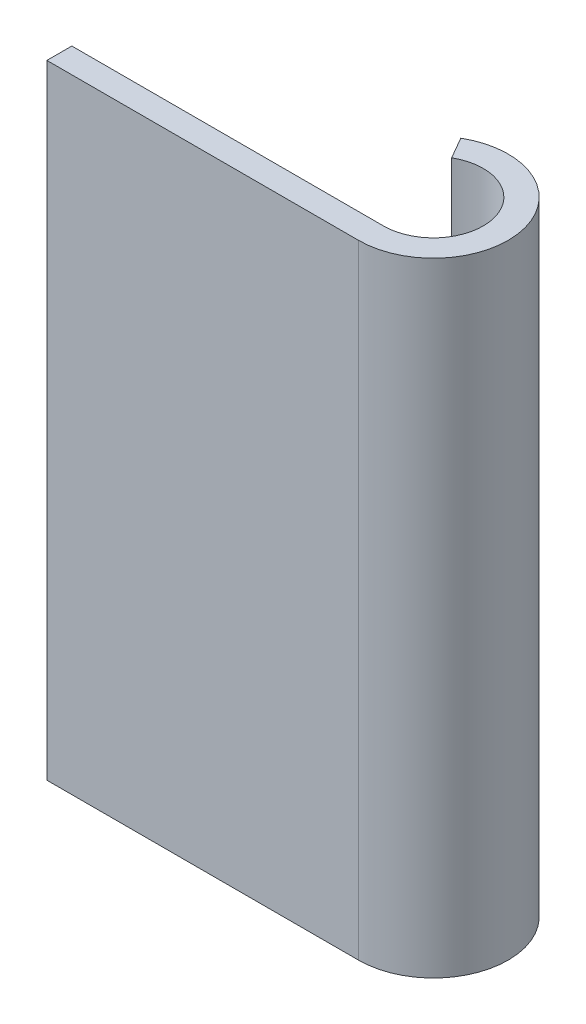
ISO-10303-21;
HEADER;
FILE_DESCRIPTION(('STEP AP214'),'2;1');
FILE_NAME('part.step','',(''),(''),'','','');
FILE_SCHEMA(('AUTOMOTIVE_DESIGN { 1 0 10303 214 1 1 1 1 }'));
ENDSEC;
DATA;
#1=APPLICATION_CONTEXT('core data for automotive mechanical design processes');
#2=APPLICATION_PROTOCOL_DEFINITION('international standard','automotive_design',2000,#1);
#3=PRODUCT_CONTEXT('',#1,'mechanical');
#4=PRODUCT('Part','Part','',(#3));
#5=PRODUCT_RELATED_PRODUCT_CATEGORY('part','',(#4));
#6=PRODUCT_DEFINITION_FORMATION('','',#4);
#7=PRODUCT_DEFINITION_CONTEXT('part definition',#1,'design');
#8=PRODUCT_DEFINITION('design','',#6,#7);
#9=PRODUCT_DEFINITION_SHAPE('','',#8);
#10=(LENGTH_UNIT() NAMED_UNIT(*) SI_UNIT(.MILLI.,.METRE.));
#11=(NAMED_UNIT(*) PLANE_ANGLE_UNIT() SI_UNIT($,.RADIAN.));
#12=(NAMED_UNIT(*) SI_UNIT($,.STERADIAN.) SOLID_ANGLE_UNIT());
#13=UNCERTAINTY_MEASURE_WITH_UNIT(LENGTH_MEASURE(1.E-05),#10,'distance_accuracy_value','');
#14=(GEOMETRIC_REPRESENTATION_CONTEXT(3) GLOBAL_UNCERTAINTY_ASSIGNED_CONTEXT((#13)) GLOBAL_UNIT_ASSIGNED_CONTEXT((#10,
#11,#12)) REPRESENTATION_CONTEXT('',''));
#15=CARTESIAN_POINT('',(0.,0.,0.));
#16=DIRECTION('',(0.,0.,1.));
#17=DIRECTION('',(1.,0.,0.));
#18=AXIS2_PLACEMENT_3D('',#15,#16,#17);
#19=CARTESIAN_POINT('',(0.,40.,0.));
#20=DIRECTION('',(0.,-1.,0.));
#21=DIRECTION('',(0.,0.,-1.));
#22=AXIS2_PLACEMENT_3D('',#19,#20,#21);
#23=CYLINDRICAL_SURFACE('',#22,3.2);
#24=CARTESIAN_POINT('',(0.,0.,0.));
#25=DIRECTION('',(0.,-1.,0.));
#26=DIRECTION('',(0.,0.,-1.));
#27=AXIS2_PLACEMENT_3D('',#24,#25,#26);
#28=CIRCLE('',#27,3.2);
#29=CARTESIAN_POINT('',(-1.60000000000001,0.,-2.7712812921102));
#30=VERTEX_POINT('',#29);
#31=CARTESIAN_POINT('',(0.,0.,3.2));
#32=VERTEX_POINT('',#31);
#33=EDGE_CURVE('E128',#30,#32,#28,.T.);
#34=ORIENTED_EDGE('',*,*,#33,.T.);
#35=DIRECTION('',(0.,-1.,0.));
#36=VECTOR('',#35,1.);
#37=CARTESIAN_POINT('',(0.,40.,3.2));
#38=LINE('',#37,#36);
#39=CARTESIAN_POINT('',(0.,40.,3.2));
#40=VERTEX_POINT('',#39);
#41=EDGE_CURVE('E11',#40,#32,#38,.T.);
#42=ORIENTED_EDGE('',*,*,#41,.F.);
#43=CARTESIAN_POINT('',(0.,40.,0.));
#44=DIRECTION('',(0.,-1.,0.));
#45=DIRECTION('',(0.,0.,-1.));
#46=AXIS2_PLACEMENT_3D('',#43,#44,#45);
#47=CIRCLE('',#46,3.2);
#48=CARTESIAN_POINT('',(-1.60000000000001,40.,-2.7712812921102));
#49=VERTEX_POINT('',#48);
#50=EDGE_CURVE('E144',#49,#40,#47,.T.);
#51=ORIENTED_EDGE('',*,*,#50,.F.);
#52=DIRECTION('',(0.,-1.,0.));
#53=VECTOR('',#52,1.);
#54=CARTESIAN_POINT('',(-1.60000000000001,40.,-2.7712812921102));
#55=LINE('',#54,#53);
#56=EDGE_CURVE('E124',#49,#30,#55,.T.);
#57=ORIENTED_EDGE('',*,*,#56,.T.);
#58=EDGE_LOOP('',(#34,#42,#51,#57));
#59=FACE_BOUND('',#58,.T.);
#60=ADVANCED_FACE('F39',(#59),#23,.F.);
#61=CARTESIAN_POINT('',(0.,40.,3.2));
#62=DIRECTION('',(0.,0.,1.));
#63=DIRECTION('',(1.,0.,0.));
#64=AXIS2_PLACEMENT_3D('',#61,#62,#63);
#65=PLANE('',#64);
#66=DIRECTION('',(-1.,0.,0.));
#67=VECTOR('',#66,1.);
#68=CARTESIAN_POINT('',(0.,0.,3.2));
#69=LINE('',#68,#67);
#70=CARTESIAN_POINT('',(-20.,0.,3.2));
#71=VERTEX_POINT('',#70);
#72=EDGE_CURVE('E132',#32,#71,#69,.T.);
#73=ORIENTED_EDGE('',*,*,#72,.T.);
#74=DIRECTION('',(0.,-1.,0.));
#75=VECTOR('',#74,1.);
#76=CARTESIAN_POINT('',(-20.,40.,3.2));
#77=LINE('',#76,#75);
#78=CARTESIAN_POINT('',(-20.,40.,3.2));
#79=VERTEX_POINT('',#78);
#80=EDGE_CURVE('E48',#79,#71,#77,.T.);
#81=ORIENTED_EDGE('',*,*,#80,.F.);
#82=DIRECTION('',(-1.,0.,0.));
#83=VECTOR('',#82,1.);
#84=CARTESIAN_POINT('',(0.,40.,3.2));
#85=LINE('',#84,#83);
#86=EDGE_CURVE('E93',#40,#79,#85,.T.);
#87=ORIENTED_EDGE('',*,*,#86,.F.);
#88=ORIENTED_EDGE('',*,*,#41,.T.);
#89=EDGE_LOOP('',(#73,#81,#87,#88));
#90=FACE_BOUND('',#89,.T.);
#91=ADVANCED_FACE('F172',(#90),#65,.F.);
#92=CARTESIAN_POINT('',(-20.,40.,3.2));
#93=DIRECTION('',(1.,0.,0.));
#94=DIRECTION('',(0.,0.,-1.));
#95=AXIS2_PLACEMENT_3D('',#92,#93,#94);
#96=PLANE('',#95);
#97=DIRECTION('',(0.,0.,1.));
#98=VECTOR('',#97,1.);
#99=CARTESIAN_POINT('',(-20.,0.,3.2));
#100=LINE('',#99,#98);
#101=CARTESIAN_POINT('',(-20.,0.,4.8));
#102=VERTEX_POINT('',#101);
#103=EDGE_CURVE('E135',#71,#102,#100,.T.);
#104=ORIENTED_EDGE('',*,*,#103,.T.);
#105=DIRECTION('',(0.,-1.,0.));
#106=VECTOR('',#105,1.);
#107=CARTESIAN_POINT('',(-20.,40.,4.8));
#108=LINE('',#107,#106);
#109=CARTESIAN_POINT('',(-20.,40.,4.8));
#110=VERTEX_POINT('',#109);
#111=EDGE_CURVE('E117',#110,#102,#108,.T.);
#112=ORIENTED_EDGE('',*,*,#111,.F.);
#113=DIRECTION('',(0.,0.,1.));
#114=VECTOR('',#113,1.);
#115=CARTESIAN_POINT('',(-20.,40.,3.2));
#116=LINE('',#115,#114);
#117=EDGE_CURVE('E106',#79,#110,#116,.T.);
#118=ORIENTED_EDGE('',*,*,#117,.F.);
#119=ORIENTED_EDGE('',*,*,#80,.T.);
#120=EDGE_LOOP('',(#104,#112,#118,#119));
#121=FACE_BOUND('',#120,.T.);
#122=ADVANCED_FACE('F154',(#121),#96,.F.);
#123=CARTESIAN_POINT('',(-20.,40.,4.8));
#124=DIRECTION('',(0.,0.,-1.));
#125=DIRECTION('',(-1.,0.,0.));
#126=AXIS2_PLACEMENT_3D('',#123,#124,#125);
#127=PLANE('',#126);
#128=DIRECTION('',(1.,0.,0.));
#129=VECTOR('',#128,1.);
#130=CARTESIAN_POINT('',(-20.,0.,4.8));
#131=LINE('',#130,#129);
#132=CARTESIAN_POINT('',(0.,0.,4.8));
#133=VERTEX_POINT('',#132);
#134=EDGE_CURVE('E115',#102,#133,#131,.T.);
#135=ORIENTED_EDGE('',*,*,#134,.T.);
#136=DIRECTION('',(0.,-1.,0.));
#137=VECTOR('',#136,1.);
#138=CARTESIAN_POINT('',(0.,40.,4.8));
#139=LINE('',#138,#137);
#140=CARTESIAN_POINT('',(0.,40.,4.8));
#141=VERTEX_POINT('',#140);
#142=EDGE_CURVE('E112',#141,#133,#139,.T.);
#143=ORIENTED_EDGE('',*,*,#142,.F.);
#144=DIRECTION('',(1.,0.,0.));
#145=VECTOR('',#144,1.);
#146=CARTESIAN_POINT('',(-20.,40.,4.8));
#147=LINE('',#146,#145);
#148=EDGE_CURVE('E100',#110,#141,#147,.T.);
#149=ORIENTED_EDGE('',*,*,#148,.F.);
#150=ORIENTED_EDGE('',*,*,#111,.T.);
#151=EDGE_LOOP('',(#135,#143,#149,#150));
#152=FACE_BOUND('',#151,.T.);
#153=ADVANCED_FACE('F113',(#152),#127,.F.);
#154=CARTESIAN_POINT('',(0.,40.,0.));
#155=DIRECTION('',(0.,-1.,0.));
#156=DIRECTION('',(0.,0.,-1.));
#157=AXIS2_PLACEMENT_3D('',#154,#155,#156);
#158=CYLINDRICAL_SURFACE('',#157,4.8);
#159=CARTESIAN_POINT('',(0.,0.,0.));
#160=DIRECTION('',(0.,1.,0.));
#161=DIRECTION('',(0.,0.,-1.));
#162=AXIS2_PLACEMENT_3D('',#159,#160,#161);
#163=CIRCLE('',#162,4.8);
#164=CARTESIAN_POINT('',(-2.40000000000002,0.,-4.1569219381653));
#165=VERTEX_POINT('',#164);
#166=EDGE_CURVE('E79',#133,#165,#163,.T.);
#167=ORIENTED_EDGE('',*,*,#166,.T.);
#168=DIRECTION('',(0.,-1.,0.));
#169=VECTOR('',#168,1.);
#170=CARTESIAN_POINT('',(-2.40000000000002,40.,-4.1569219381653));
#171=LINE('',#170,#169);
#172=CARTESIAN_POINT('',(-2.40000000000002,40.,-4.1569219381653));
#173=VERTEX_POINT('',#172);
#174=EDGE_CURVE('E118',#173,#165,#171,.T.);
#175=ORIENTED_EDGE('',*,*,#174,.F.);
#176=CARTESIAN_POINT('',(0.,40.,0.));
#177=DIRECTION('',(0.,1.,0.));
#178=DIRECTION('',(0.,0.,-1.));
#179=AXIS2_PLACEMENT_3D('',#176,#177,#178);
#180=CIRCLE('',#179,4.8);
#181=EDGE_CURVE('E104',#141,#173,#180,.T.);
#182=ORIENTED_EDGE('',*,*,#181,.F.);
#183=ORIENTED_EDGE('',*,*,#142,.T.);
#184=EDGE_LOOP('',(#167,#175,#182,#183));
#185=FACE_BOUND('',#184,.T.);
#186=ADVANCED_FACE('F120',(#185),#158,.T.);
#187=CARTESIAN_POINT('',(-2.40000000000002,40.,-4.1569219381653));
#188=DIRECTION('',(0.866025403784436,0.,-0.500000000000005));
#189=DIRECTION('',(-0.500000000000005,0.,-0.866025403784436));
#190=AXIS2_PLACEMENT_3D('',#187,#188,#189);
#191=PLANE('',#190);
#192=DIRECTION('',(0.500000000000005,0.,0.866025403784436));
#193=VECTOR('',#192,1.);
#194=CARTESIAN_POINT('',(-2.40000000000002,0.,-4.1569219381653));
#195=LINE('',#194,#193);
#196=EDGE_CURVE('E85',#165,#30,#195,.T.);
#197=ORIENTED_EDGE('',*,*,#196,.T.);
#198=ORIENTED_EDGE('',*,*,#56,.F.);
#199=DIRECTION('',(0.500000000000005,0.,0.866025403784436));
#200=VECTOR('',#199,1.);
#201=CARTESIAN_POINT('',(-2.40000000000002,40.,-4.1569219381653));
#202=LINE('',#201,#200);
#203=EDGE_CURVE('E56',#173,#49,#202,.T.);
#204=ORIENTED_EDGE('',*,*,#203,.F.);
#205=ORIENTED_EDGE('',*,*,#174,.T.);
#206=EDGE_LOOP('',(#197,#198,#204,#205));
#207=FACE_BOUND('',#206,.T.);
#208=ADVANCED_FACE('F161',(#207),#191,.F.);
#209=CARTESIAN_POINT('',(0.,40.,0.));
#210=DIRECTION('',(0.,-1.,0.));
#211=DIRECTION('',(0.,0.,-1.));
#212=AXIS2_PLACEMENT_3D('',#209,#210,#211);
#213=PLANE('',#212);
#214=ORIENTED_EDGE('',*,*,#50,.T.);
#215=ORIENTED_EDGE('',*,*,#86,.T.);
#216=ORIENTED_EDGE('',*,*,#117,.T.);
#217=ORIENTED_EDGE('',*,*,#148,.T.);
#218=ORIENTED_EDGE('',*,*,#181,.T.);
#219=ORIENTED_EDGE('',*,*,#203,.T.);
#220=EDGE_LOOP('',(#214,#215,#216,#217,#218,#219));
#221=FACE_BOUND('',#220,.T.);
#222=ADVANCED_FACE('F102',(#221),#213,.F.);
#223=CARTESIAN_POINT('',(0.,0.,0.));
#224=DIRECTION('',(0.,-1.,0.));
#225=DIRECTION('',(0.,0.,-1.));
#226=AXIS2_PLACEMENT_3D('',#223,#224,#225);
#227=PLANE('',#226);
#228=ORIENTED_EDGE('',*,*,#33,.F.);
#229=ORIENTED_EDGE('',*,*,#196,.F.);
#230=ORIENTED_EDGE('',*,*,#166,.F.);
#231=ORIENTED_EDGE('',*,*,#134,.F.);
#232=ORIENTED_EDGE('',*,*,#103,.F.);
#233=ORIENTED_EDGE('',*,*,#72,.F.);
#234=EDGE_LOOP('',(#228,#229,#230,#231,#232,#233));
#235=FACE_BOUND('',#234,.T.);
#236=ADVANCED_FACE('F157',(#235),#227,.T.);
#237=CLOSED_SHELL('',(#60,#91,#122,#153,#186,#208,#222,#236));
#238=MANIFOLD_SOLID_BREP('B2',#237);
#239=ADVANCED_BREP_SHAPE_REPRESENTATION('',(#18,#238),#14);
#240=SHAPE_DEFINITION_REPRESENTATION(#9,#239);
ENDSEC;
END-ISO-10303-21;
